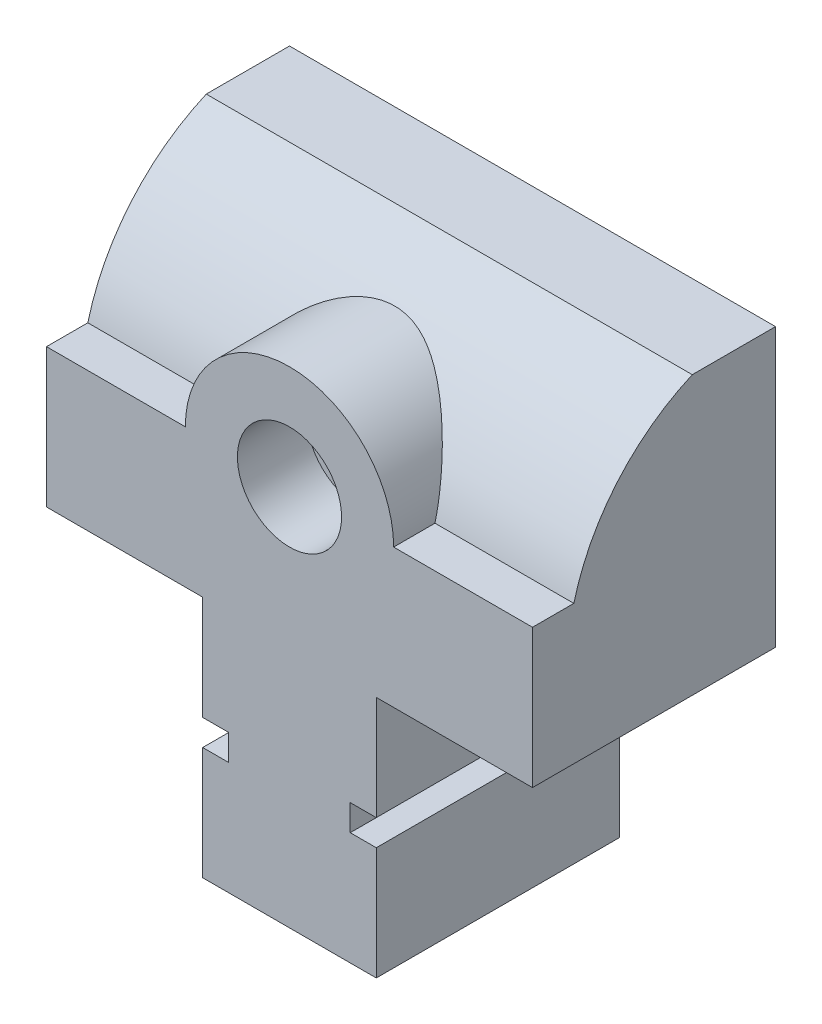
ISO-10303-21;
HEADER;
FILE_DESCRIPTION(('STEP AP214'),'2;1');
FILE_NAME('part.step','',(''),(''),'','','');
FILE_SCHEMA(('AUTOMOTIVE_DESIGN { 1 0 10303 214 1 1 1 1 }'));
ENDSEC;
DATA;
#1=APPLICATION_CONTEXT('core data for automotive mechanical design processes');
#2=APPLICATION_PROTOCOL_DEFINITION('international standard','automotive_design',2000,#1);
#3=PRODUCT_CONTEXT('',#1,'mechanical');
#4=PRODUCT('Part','Part','',(#3));
#5=PRODUCT_RELATED_PRODUCT_CATEGORY('part','',(#4));
#6=PRODUCT_DEFINITION_FORMATION('','',#4);
#7=PRODUCT_DEFINITION_CONTEXT('part definition',#1,'design');
#8=PRODUCT_DEFINITION('design','',#6,#7);
#9=PRODUCT_DEFINITION_SHAPE('','',#8);
#10=(LENGTH_UNIT() NAMED_UNIT(*) SI_UNIT(.MILLI.,.METRE.));
#11=(NAMED_UNIT(*) PLANE_ANGLE_UNIT() SI_UNIT($,.RADIAN.));
#12=(NAMED_UNIT(*) SI_UNIT($,.STERADIAN.) SOLID_ANGLE_UNIT());
#13=UNCERTAINTY_MEASURE_WITH_UNIT(LENGTH_MEASURE(1.E-05),#10,'distance_accuracy_value','');
#14=(GEOMETRIC_REPRESENTATION_CONTEXT(3) GLOBAL_UNCERTAINTY_ASSIGNED_CONTEXT((#13)) GLOBAL_UNIT_ASSIGNED_CONTEXT((#10,
#11,#12)) REPRESENTATION_CONTEXT('',''));
#15=CARTESIAN_POINT('',(0.,0.,0.));
#16=DIRECTION('',(0.,0.,1.));
#17=DIRECTION('',(1.,0.,0.));
#18=AXIS2_PLACEMENT_3D('',#15,#16,#17);
#19=CARTESIAN_POINT('',(0.,0.,-44.45));
#20=DIRECTION('',(-1.,0.,0.));
#21=DIRECTION('',(0.,0.,1.));
#22=AXIS2_PLACEMENT_3D('',#19,#20,#21);
#23=PLANE('',#22);
#24=DIRECTION('',(0.,-1.,0.));
#25=VECTOR('',#24,1.);
#26=CARTESIAN_POINT('',(0.,0.,0.));
#27=LINE('',#26,#25);
#28=CARTESIAN_POINT('',(0.,20.6375,0.));
#29=VERTEX_POINT('',#28);
#30=CARTESIAN_POINT('',(0.,0.,0.));
#31=VERTEX_POINT('',#30);
#32=EDGE_CURVE('E269',#29,#31,#27,.T.);
#33=ORIENTED_EDGE('',*,*,#32,.F.);
#34=DIRECTION('',(0.,0.,1.));
#35=VECTOR('',#34,1.);
#36=CARTESIAN_POINT('',(0.,20.6375,-44.45));
#37=LINE('',#36,#35);
#38=CARTESIAN_POINT('',(0.,20.6375,-44.45));
#39=VERTEX_POINT('',#38);
#40=EDGE_CURVE('E206',#39,#29,#37,.T.);
#41=ORIENTED_EDGE('',*,*,#40,.F.);
#42=DIRECTION('',(0.,-1.,0.));
#43=VECTOR('',#42,1.);
#44=CARTESIAN_POINT('',(0.,0.,-44.45));
#45=LINE('',#44,#43);
#46=CARTESIAN_POINT('',(0.,0.,-44.45));
#47=VERTEX_POINT('',#46);
#48=EDGE_CURVE('E195',#39,#47,#45,.T.);
#49=ORIENTED_EDGE('',*,*,#48,.T.);
#50=DIRECTION('',(0.,0.,1.));
#51=VECTOR('',#50,1.);
#52=CARTESIAN_POINT('',(0.,0.,-44.45));
#53=LINE('',#52,#51);
#54=EDGE_CURVE('E42',#47,#31,#53,.T.);
#55=ORIENTED_EDGE('',*,*,#54,.T.);
#56=EDGE_LOOP('',(#33,#41,#49,#55));
#57=FACE_BOUND('',#56,.T.);
#58=ADVANCED_FACE('F39',(#57),#23,.T.);
#59=CARTESIAN_POINT('',(0.,44.45,-44.45));
#60=VERTEX_POINT('',#59);
#61=CARTESIAN_POINT('',(0.,25.4,-44.45));
#62=VERTEX_POINT('',#61);
#63=EDGE_CURVE('E270',#60,#62,#45,.T.);
#64=ORIENTED_EDGE('',*,*,#63,.T.);
#65=DIRECTION('',(0.,0.,1.));
#66=VECTOR('',#65,1.);
#67=CARTESIAN_POINT('',(0.,25.4,-44.45));
#68=LINE('',#67,#66);
#69=CARTESIAN_POINT('',(0.,25.4,0.));
#70=VERTEX_POINT('',#69);
#71=EDGE_CURVE('E209',#62,#70,#68,.T.);
#72=ORIENTED_EDGE('',*,*,#71,.T.);
#73=CARTESIAN_POINT('',(0.,44.45,0.));
#74=VERTEX_POINT('',#73);
#75=EDGE_CURVE('E320',#74,#70,#27,.T.);
#76=ORIENTED_EDGE('',*,*,#75,.F.);
#77=DIRECTION('',(0.,0.,1.));
#78=VECTOR('',#77,1.);
#79=CARTESIAN_POINT('',(0.,44.45,-44.45));
#80=LINE('',#79,#78);
#81=EDGE_CURVE('E11',#60,#74,#80,.T.);
#82=ORIENTED_EDGE('',*,*,#81,.F.);
#83=EDGE_LOOP('',(#64,#72,#76,#82));
#84=FACE_BOUND('',#83,.T.);
#85=ADVANCED_FACE('F308',(#84),#23,.T.);
#86=CARTESIAN_POINT('',(31.75,0.,-44.45));
#87=DIRECTION('',(1.,0.,0.));
#88=DIRECTION('',(0.,0.,-1.));
#89=AXIS2_PLACEMENT_3D('',#86,#87,#88);
#90=PLANE('',#89);
#91=DIRECTION('',(0.,0.,1.));
#92=VECTOR('',#91,1.);
#93=CARTESIAN_POINT('',(31.75,25.4,-44.45));
#94=LINE('',#93,#92);
#95=CARTESIAN_POINT('',(31.75,25.4,-44.45));
#96=VERTEX_POINT('',#95);
#97=CARTESIAN_POINT('',(31.75,25.4,0.));
#98=VERTEX_POINT('',#97);
#99=EDGE_CURVE('E230',#96,#98,#94,.T.);
#100=ORIENTED_EDGE('',*,*,#99,.F.);
#101=DIRECTION('',(0.,1.,0.));
#102=VECTOR('',#101,1.);
#103=CARTESIAN_POINT('',(31.75,0.,-44.45));
#104=LINE('',#103,#102);
#105=CARTESIAN_POINT('',(31.75,44.45,-44.45));
#106=VERTEX_POINT('',#105);
#107=EDGE_CURVE('E384',#96,#106,#104,.T.);
#108=ORIENTED_EDGE('',*,*,#107,.T.);
#109=DIRECTION('',(0.,0.,1.));
#110=VECTOR('',#109,1.);
#111=CARTESIAN_POINT('',(31.75,44.45,-44.45));
#112=LINE('',#111,#110);
#113=CARTESIAN_POINT('',(31.75,44.45,0.));
#114=VERTEX_POINT('',#113);
#115=EDGE_CURVE('E365',#106,#114,#112,.T.);
#116=ORIENTED_EDGE('',*,*,#115,.T.);
#117=DIRECTION('',(0.,1.,0.));
#118=VECTOR('',#117,1.);
#119=CARTESIAN_POINT('',(31.75,0.,0.));
#120=LINE('',#119,#118);
#121=EDGE_CURVE('E329',#98,#114,#120,.T.);
#122=ORIENTED_EDGE('',*,*,#121,.F.);
#123=EDGE_LOOP('',(#100,#108,#116,#122));
#124=FACE_BOUND('',#123,.T.);
#125=ADVANCED_FACE('F288',(#124),#90,.T.);
#126=CARTESIAN_POINT('',(15.875,69.85,-44.45));
#127=DIRECTION('',(0.,0.,-1.));
#128=DIRECTION('',(-1.,0.,0.));
#129=AXIS2_PLACEMENT_3D('',#126,#127,#128);
#130=PLANE('',#129);
#131=ORIENTED_EDGE('',*,*,#48,.F.);
#132=DIRECTION('',(-1.,0.,0.));
#133=VECTOR('',#132,1.);
#134=CARTESIAN_POINT('',(0.,20.6375,-44.45));
#135=LINE('',#134,#133);
#136=CARTESIAN_POINT('',(4.7625,20.6375,-44.45));
#137=VERTEX_POINT('',#136);
#138=EDGE_CURVE('E187',#137,#39,#135,.T.);
#139=ORIENTED_EDGE('',*,*,#138,.F.);
#140=DIRECTION('',(0.,-1.,0.));
#141=VECTOR('',#140,1.);
#142=CARTESIAN_POINT('',(4.76250000000001,0.,-44.45));
#143=LINE('',#142,#141);
#144=CARTESIAN_POINT('',(4.7625,25.4,-44.45));
#145=VERTEX_POINT('',#144);
#146=EDGE_CURVE('E177',#145,#137,#143,.T.);
#147=ORIENTED_EDGE('',*,*,#146,.F.);
#148=DIRECTION('',(1.,0.,0.));
#149=VECTOR('',#148,1.);
#150=CARTESIAN_POINT('',(0.,25.4,-44.45));
#151=LINE('',#150,#149);
#152=EDGE_CURVE('E186',#62,#145,#151,.T.);
#153=ORIENTED_EDGE('',*,*,#152,.F.);
#154=ORIENTED_EDGE('',*,*,#63,.F.);
#155=DIRECTION('',(1.,0.,0.));
#156=VECTOR('',#155,1.);
#157=CARTESIAN_POINT('',(0.,44.45,-44.45));
#158=LINE('',#157,#156);
#159=CARTESIAN_POINT('',(-28.575,44.45,-44.45));
#160=VERTEX_POINT('',#159);
#161=EDGE_CURVE('E326',#160,#60,#158,.T.);
#162=ORIENTED_EDGE('',*,*,#161,.F.);
#163=DIRECTION('',(0.,-1.,0.));
#164=VECTOR('',#163,1.);
#165=CARTESIAN_POINT('',(-28.575,44.45,-44.45));
#166=LINE('',#165,#164);
#167=CARTESIAN_POINT('',(-28.575,95.25,-44.45));
#168=VERTEX_POINT('',#167);
#169=EDGE_CURVE('E372',#168,#160,#166,.T.);
#170=ORIENTED_EDGE('',*,*,#169,.F.);
#171=DIRECTION('',(-1.,0.,0.));
#172=VECTOR('',#171,1.);
#173=CARTESIAN_POINT('',(60.325,95.25,-44.45));
#174=LINE('',#173,#172);
#175=CARTESIAN_POINT('',(60.325,95.25,-44.45));
#176=VERTEX_POINT('',#175);
#177=EDGE_CURVE('E253',#176,#168,#174,.T.);
#178=ORIENTED_EDGE('',*,*,#177,.F.);
#179=DIRECTION('',(0.,1.,0.));
#180=VECTOR('',#179,1.);
#181=CARTESIAN_POINT('',(60.325,44.45,-44.45));
#182=LINE('',#181,#180);
#183=CARTESIAN_POINT('',(60.325,44.45,-44.45));
#184=VERTEX_POINT('',#183);
#185=EDGE_CURVE('E375',#184,#176,#182,.T.);
#186=ORIENTED_EDGE('',*,*,#185,.F.);
#187=DIRECTION('',(1.,0.,0.));
#188=VECTOR('',#187,1.);
#189=CARTESIAN_POINT('',(31.75,44.45,-44.45));
#190=LINE('',#189,#188);
#191=EDGE_CURVE('E377',#106,#184,#190,.T.);
#192=ORIENTED_EDGE('',*,*,#191,.F.);
#193=ORIENTED_EDGE('',*,*,#107,.F.);
#194=DIRECTION('',(-1.,0.,0.));
#195=VECTOR('',#194,1.);
#196=CARTESIAN_POINT('',(0.,25.4,-44.45));
#197=LINE('',#196,#195);
#198=CARTESIAN_POINT('',(26.9875,25.4,-44.45));
#199=VERTEX_POINT('',#198);
#200=EDGE_CURVE('E220',#96,#199,#197,.T.);
#201=ORIENTED_EDGE('',*,*,#200,.T.);
#202=DIRECTION('',(0.,-1.,0.));
#203=VECTOR('',#202,1.);
#204=CARTESIAN_POINT('',(26.9875,0.,-44.45));
#205=LINE('',#204,#203);
#206=CARTESIAN_POINT('',(26.9875,20.6375,-44.45));
#207=VERTEX_POINT('',#206);
#208=EDGE_CURVE('E213',#199,#207,#205,.T.);
#209=ORIENTED_EDGE('',*,*,#208,.T.);
#210=DIRECTION('',(1.,0.,0.));
#211=VECTOR('',#210,1.);
#212=CARTESIAN_POINT('',(0.,20.6375,-44.45));
#213=LINE('',#212,#211);
#214=CARTESIAN_POINT('',(31.75,20.6375,-44.45));
#215=VERTEX_POINT('',#214);
#216=EDGE_CURVE('E216',#207,#215,#213,.T.);
#217=ORIENTED_EDGE('',*,*,#216,.T.);
#218=CARTESIAN_POINT('',(31.75,0.,-44.45));
#219=VERTEX_POINT('',#218);
#220=EDGE_CURVE('E382',#219,#215,#104,.T.);
#221=ORIENTED_EDGE('',*,*,#220,.F.);
#222=DIRECTION('',(1.,0.,0.));
#223=VECTOR('',#222,1.);
#224=CARTESIAN_POINT('',(0.,0.,-44.45));
#225=LINE('',#224,#223);
#226=EDGE_CURVE('E385',#47,#219,#225,.T.);
#227=ORIENTED_EDGE('',*,*,#226,.F.);
#228=EDGE_LOOP('',(#131,#139,#147,#153,#154,#162,#170,#178,#186,#192,#193,#201,#209,#217,#221,#227));
#229=FACE_BOUND('',#228,.T.);
#230=ADVANCED_FACE('F193',(#229),#130,.T.);
#231=CARTESIAN_POINT('',(15.875,69.85,0.));
#232=DIRECTION('',(0.,0.,-1.));
#233=DIRECTION('',(-1.,0.,0.));
#234=AXIS2_PLACEMENT_3D('',#231,#232,#233);
#235=PLANE('',#234);
#236=CARTESIAN_POINT('',(15.875,69.85,0.));
#237=DIRECTION('',(0.,0.,1.));
#238=DIRECTION('',(1.,0.,0.));
#239=AXIS2_PLACEMENT_3D('',#236,#237,#238);
#240=CIRCLE('',#239,9.525);
#241=CARTESIAN_POINT('',(25.4,69.85,0.));
#242=VERTEX_POINT('',#241);
#243=EDGE_CURVE('E208',#242,#242,#240,.T.);
#244=ORIENTED_EDGE('',*,*,#243,.F.);
#245=EDGE_LOOP('',(#244));
#246=FACE_BOUND('',#245,.T.);
#247=DIRECTION('',(-1.,0.,0.));
#248=VECTOR('',#247,1.);
#249=CARTESIAN_POINT('',(0.,20.6375,0.));
#250=LINE('',#249,#248);
#251=CARTESIAN_POINT('',(4.76250000000001,20.6375,0.));
#252=VERTEX_POINT('',#251);
#253=EDGE_CURVE('E55',#252,#29,#250,.T.);
#254=ORIENTED_EDGE('',*,*,#253,.T.);
#255=ORIENTED_EDGE('',*,*,#32,.T.);
#256=DIRECTION('',(1.,0.,0.));
#257=VECTOR('',#256,1.);
#258=CARTESIAN_POINT('',(0.,0.,0.));
#259=LINE('',#258,#257);
#260=CARTESIAN_POINT('',(31.75,0.,0.));
#261=VERTEX_POINT('',#260);
#262=EDGE_CURVE('E323',#31,#261,#259,.T.);
#263=ORIENTED_EDGE('',*,*,#262,.T.);
#264=CARTESIAN_POINT('',(31.75,20.6375,0.));
#265=VERTEX_POINT('',#264);
#266=EDGE_CURVE('E330',#261,#265,#120,.T.);
#267=ORIENTED_EDGE('',*,*,#266,.T.);
#268=DIRECTION('',(1.,0.,0.));
#269=VECTOR('',#268,1.);
#270=CARTESIAN_POINT('',(0.,20.6375,0.));
#271=LINE('',#270,#269);
#272=CARTESIAN_POINT('',(26.9875,20.6375,0.));
#273=VERTEX_POINT('',#272);
#274=EDGE_CURVE('E225',#273,#265,#271,.T.);
#275=ORIENTED_EDGE('',*,*,#274,.F.);
#276=DIRECTION('',(0.,-1.,0.));
#277=VECTOR('',#276,1.);
#278=CARTESIAN_POINT('',(26.9875,0.,0.));
#279=LINE('',#278,#277);
#280=CARTESIAN_POINT('',(26.9875,25.4,0.));
#281=VERTEX_POINT('',#280);
#282=EDGE_CURVE('E63',#281,#273,#279,.T.);
#283=ORIENTED_EDGE('',*,*,#282,.F.);
#284=DIRECTION('',(-1.,0.,0.));
#285=VECTOR('',#284,1.);
#286=CARTESIAN_POINT('',(0.,25.4,0.));
#287=LINE('',#286,#285);
#288=EDGE_CURVE('E217',#98,#281,#287,.T.);
#289=ORIENTED_EDGE('',*,*,#288,.F.);
#290=ORIENTED_EDGE('',*,*,#121,.T.);
#291=DIRECTION('',(1.,0.,0.));
#292=VECTOR('',#291,1.);
#293=CARTESIAN_POINT('',(31.75,44.45,0.));
#294=LINE('',#293,#292);
#295=CARTESIAN_POINT('',(60.325,44.45,0.));
#296=VERTEX_POINT('',#295);
#297=EDGE_CURVE('E333',#114,#296,#294,.T.);
#298=ORIENTED_EDGE('',*,*,#297,.T.);
#299=DIRECTION('',(0.,1.,0.));
#300=VECTOR('',#299,1.);
#301=CARTESIAN_POINT('',(60.325,44.45,0.));
#302=LINE('',#301,#300);
#303=CARTESIAN_POINT('',(60.325,69.85,0.));
#304=VERTEX_POINT('',#303);
#305=EDGE_CURVE('E336',#296,#304,#302,.T.);
#306=ORIENTED_EDGE('',*,*,#305,.T.);
#307=DIRECTION('',(-1.,0.,0.));
#308=VECTOR('',#307,1.);
#309=CARTESIAN_POINT('',(60.325,69.85,0.));
#310=LINE('',#309,#308);
#311=CARTESIAN_POINT('',(34.925,69.85,0.));
#312=VERTEX_POINT('',#311);
#313=EDGE_CURVE('E339',#304,#312,#310,.T.);
#314=ORIENTED_EDGE('',*,*,#313,.T.);
#315=CARTESIAN_POINT('',(15.875,69.85,0.));
#316=DIRECTION('',(0.,0.,1.));
#317=DIRECTION('',(-1.,0.,0.));
#318=AXIS2_PLACEMENT_3D('',#315,#316,#317);
#319=CIRCLE('',#318,19.05);
#320=CARTESIAN_POINT('',(-3.175,69.85,0.));
#321=VERTEX_POINT('',#320);
#322=EDGE_CURVE('E342',#312,#321,#319,.T.);
#323=ORIENTED_EDGE('',*,*,#322,.T.);
#324=DIRECTION('',(-1.,0.,0.));
#325=VECTOR('',#324,1.);
#326=CARTESIAN_POINT('',(-28.575,69.85,0.));
#327=LINE('',#326,#325);
#328=CARTESIAN_POINT('',(-28.575,69.85,0.));
#329=VERTEX_POINT('',#328);
#330=EDGE_CURVE('E345',#321,#329,#327,.T.);
#331=ORIENTED_EDGE('',*,*,#330,.T.);
#332=DIRECTION('',(0.,-1.,0.));
#333=VECTOR('',#332,1.);
#334=CARTESIAN_POINT('',(-28.575,44.45,0.));
#335=LINE('',#334,#333);
#336=CARTESIAN_POINT('',(-28.575,44.45,0.));
#337=VERTEX_POINT('',#336);
#338=EDGE_CURVE('E348',#329,#337,#335,.T.);
#339=ORIENTED_EDGE('',*,*,#338,.T.);
#340=DIRECTION('',(1.,0.,0.));
#341=VECTOR('',#340,1.);
#342=CARTESIAN_POINT('',(0.,44.45,0.));
#343=LINE('',#342,#341);
#344=EDGE_CURVE('E351',#337,#74,#343,.T.);
#345=ORIENTED_EDGE('',*,*,#344,.T.);
#346=ORIENTED_EDGE('',*,*,#75,.T.);
#347=DIRECTION('',(1.,0.,0.));
#348=VECTOR('',#347,1.);
#349=CARTESIAN_POINT('',(0.,25.4,0.));
#350=LINE('',#349,#348);
#351=CARTESIAN_POINT('',(4.7625,25.4,0.));
#352=VERTEX_POINT('',#351);
#353=EDGE_CURVE('E196',#70,#352,#350,.T.);
#354=ORIENTED_EDGE('',*,*,#353,.T.);
#355=DIRECTION('',(0.,-1.,0.));
#356=VECTOR('',#355,1.);
#357=CARTESIAN_POINT('',(4.76250000000001,0.,0.));
#358=LINE('',#357,#356);
#359=EDGE_CURVE('E199',#352,#252,#358,.T.);
#360=ORIENTED_EDGE('',*,*,#359,.T.);
#361=EDGE_LOOP('',(#254,#255,#263,#267,#275,#283,#289,#290,#298,#306,#314,#323,#331,#339,#345,
#346,#354,#360));
#362=FACE_BOUND('',#361,.T.);
#363=ADVANCED_FACE('F287',(#246,#362),#235,.F.);
#364=CARTESIAN_POINT('',(0.,44.45,-44.45));
#365=DIRECTION('',(0.,-1.,0.));
#366=DIRECTION('',(1.,0.,0.));
#367=AXIS2_PLACEMENT_3D('',#364,#365,#366);
#368=PLANE('',#367);
#369=ORIENTED_EDGE('',*,*,#344,.F.);
#370=DIRECTION('',(0.,0.,1.));
#371=VECTOR('',#370,1.);
#372=CARTESIAN_POINT('',(-28.575,44.45,-44.45));
#373=LINE('',#372,#371);
#374=EDGE_CURVE('E47',#160,#337,#373,.T.);
#375=ORIENTED_EDGE('',*,*,#374,.F.);
#376=ORIENTED_EDGE('',*,*,#161,.T.);
#377=ORIENTED_EDGE('',*,*,#81,.T.);
#378=EDGE_LOOP('',(#369,#375,#376,#377));
#379=FACE_BOUND('',#378,.T.);
#380=ADVANCED_FACE('F291',(#379),#368,.T.);
#381=CARTESIAN_POINT('',(-28.575,44.45,-44.45));
#382=DIRECTION('',(-1.,0.,0.));
#383=DIRECTION('',(0.,0.,1.));
#384=AXIS2_PLACEMENT_3D('',#381,#382,#383);
#385=PLANE('',#384);
#386=ORIENTED_EDGE('',*,*,#338,.F.);
#387=DIRECTION('',(0.,0.,1.));
#388=VECTOR('',#387,1.);
#389=CARTESIAN_POINT('',(-28.575,69.85,-44.45));
#390=LINE('',#389,#388);
#391=CARTESIAN_POINT('',(-28.575,69.85,-7.55983362737435));
#392=VERTEX_POINT('',#391);
#393=EDGE_CURVE('E355',#392,#329,#390,.T.);
#394=ORIENTED_EDGE('',*,*,#393,.F.);
#395=CARTESIAN_POINT('',(-28.575,60.325,-44.45));
#396=DIRECTION('',(-1.,0.,0.));
#397=DIRECTION('',(0.,0.,1.));
#398=AXIS2_PLACEMENT_3D('',#395,#396,#397);
#399=CIRCLE('',#398,38.1);
#400=CARTESIAN_POINT('',(-28.575,95.25,-29.2232349134821));
#401=VERTEX_POINT('',#400);
#402=EDGE_CURVE('E239',#392,#401,#399,.T.);
#403=ORIENTED_EDGE('',*,*,#402,.T.);
#404=DIRECTION('',(0.,0.,1.));
#405=VECTOR('',#404,1.);
#406=CARTESIAN_POINT('',(-28.575,95.25,0.));
#407=LINE('',#406,#405);
#408=EDGE_CURVE('E246',#168,#401,#407,.T.);
#409=ORIENTED_EDGE('',*,*,#408,.F.);
#410=ORIENTED_EDGE('',*,*,#169,.T.);
#411=ORIENTED_EDGE('',*,*,#374,.T.);
#412=EDGE_LOOP('',(#386,#394,#403,#409,#410,#411));
#413=FACE_BOUND('',#412,.T.);
#414=ADVANCED_FACE('F295',(#413),#385,.T.);
#415=CARTESIAN_POINT('',(-28.575,69.85,-44.45));
#416=DIRECTION('',(0.,1.,0.));
#417=DIRECTION('',(-1.,0.,0.));
#418=AXIS2_PLACEMENT_3D('',#415,#416,#417);
#419=PLANE('',#418);
#420=DIRECTION('',(-1.,0.,0.));
#421=VECTOR('',#420,1.);
#422=CARTESIAN_POINT('',(60.325,69.85,-7.55983362737435));
#423=LINE('',#422,#421);
#424=CARTESIAN_POINT('',(-3.175,69.85,-7.55983362737436));
#425=VERTEX_POINT('',#424);
#426=EDGE_CURVE('E248',#425,#392,#423,.T.);
#427=ORIENTED_EDGE('',*,*,#426,.T.);
#428=ORIENTED_EDGE('',*,*,#393,.T.);
#429=ORIENTED_EDGE('',*,*,#330,.F.);
#430=DIRECTION('',(0.,0.,1.));
#431=VECTOR('',#430,1.);
#432=CARTESIAN_POINT('',(-3.175,69.85,-44.45));
#433=LINE('',#432,#431);
#434=EDGE_CURVE('E357',#425,#321,#433,.T.);
#435=ORIENTED_EDGE('',*,*,#434,.F.);
#436=EDGE_LOOP('',(#427,#428,#429,#435));
#437=FACE_BOUND('',#436,.T.);
#438=ADVANCED_FACE('F298',(#437),#419,.T.);
#439=CARTESIAN_POINT('',(15.875,69.85,-44.45));
#440=DIRECTION('',(0.,0.,1.));
#441=DIRECTION('',(1.,0.,0.));
#442=AXIS2_PLACEMENT_3D('',#439,#440,#441);
#443=CYLINDRICAL_SURFACE('',#442,19.05);
#444=CARTESIAN_POINT('',(-3.175,69.85,-7.55983362737436));
#445=CARTESIAN_POINT('',(-3.17500547879675,70.1230381179598,-7.63032401139053));
#446=CARTESIAN_POINT('',(-3.1691301429011,70.3952771590789,-7.70385672116213));
#447=CARTESIAN_POINT('',(-3.14586417103013,70.9375755266592,-7.85679773490777));
#448=CARTESIAN_POINT('',(-3.1284747268772,71.2076350757909,-7.93620543000801));
#449=CARTESIAN_POINT('',(-3.08244757334969,71.7448068209935,-8.10062770595717));
#450=CARTESIAN_POINT('',(-3.05382004286125,72.0119214599555,-8.18563715520324));
#451=CARTESIAN_POINT('',(-2.98560139008859,72.5429346413271,-8.3610778137843));
#452=CARTESIAN_POINT('',(-2.94601001349025,72.806833108987,-8.45150914884563));
#453=CARTESIAN_POINT('',(-2.81183898791234,73.589424425054,-8.72928070732571));
#454=CARTESIAN_POINT('',(-2.701528933279,74.1028128054364,-8.92426509622703));
#455=CARTESIAN_POINT('',(-2.44126051409261,75.1120222906019,-9.33233325824833));
#456=CARTESIAN_POINT('',(-2.29129363081517,75.6078395949425,-9.54542091346656));
#457=CARTESIAN_POINT('',(-1.95484576685341,76.5776700960323,-9.98634692918719));
#458=CARTESIAN_POINT('',(-1.76850240510362,77.0517574036756,-10.2141275936446));
#459=CARTESIAN_POINT('',(-1.36132651251976,77.9781980650538,-10.6824999755396));
#460=CARTESIAN_POINT('',(-1.14049579154312,78.4305525576741,-10.9230910202666));
#461=CARTESIAN_POINT('',(-0.66594241299499,79.313157047446,-11.4149325293189));
#462=CARTESIAN_POINT('',(-0.412147971948656,79.7433558552655,-11.6662054272559));
#463=CARTESIAN_POINT('',(0.126116933928054,80.5795128912606,-12.1761010582385));
#464=CARTESIAN_POINT('',(0.410589310832286,80.9854696060383,-12.4347242486674));
#465=CARTESIAN_POINT('',(1.04916727588222,81.8254720988806,-12.9916667031903));
#466=CARTESIAN_POINT('',(1.40748748067741,82.2558960109427,-13.2906258598657));
#467=CARTESIAN_POINT('',(2.16017557946289,83.083251491138,-13.889684449069));
#468=CARTESIAN_POINT('',(2.55454945550945,83.4801774801792,-14.1897840628768));
#469=CARTESIAN_POINT('',(3.37823711735071,84.2391282010068,-14.7859265153288));
#470=CARTESIAN_POINT('',(3.8075444779333,84.6011593242634,-15.0819700883379));
#471=CARTESIAN_POINT('',(4.70064942714583,85.2887139694636,-15.6641402898413));
#472=CARTESIAN_POINT('',(5.16443783720706,85.6142471493997,-15.9502695279287));
#473=CARTESIAN_POINT('',(6.01641161260063,86.1565661796919,-16.4421088935393));
#474=CARTESIAN_POINT('',(6.39763844913468,86.3811985743116,-16.6512485452456));
#475=CARTESIAN_POINT('',(7.18058837282127,86.8060625792829,-17.0556704527247));
#476=CARTESIAN_POINT('',(7.58231105269622,87.0062946742309,-17.2509529836713));
#477=CARTESIAN_POINT('',(8.4052917481255,87.3802565399939,-17.6229138610059));
#478=CARTESIAN_POINT('',(8.82651496700411,87.5540313116237,-17.7996236352474));
#479=CARTESIAN_POINT('',(9.68853407888225,87.8733541682059,-18.1298370055459));
#480=CARTESIAN_POINT('',(10.1293315905514,88.0188999134353,-18.2833386777998));
#481=CARTESIAN_POINT('',(10.9289435134693,88.250319287126,-18.5307301587318));
#482=CARTESIAN_POINT('',(11.2842507723209,88.3422677802285,-18.6302898887847));
#483=CARTESIAN_POINT('',(12.0042271171504,88.5062536396269,-18.8093740237486));
#484=CARTESIAN_POINT('',(12.3688906903766,88.5783024492052,-18.8889099409842));
#485=CARTESIAN_POINT('',(13.1055926571716,88.7013182367587,-19.0255424900239));
#486=CARTESIAN_POINT('',(13.4776240954078,88.7523041890183,-19.0826593155405));
#487=CARTESIAN_POINT('',(14.2269849828965,88.8323208228693,-19.1726126783494));
#488=CARTESIAN_POINT('',(14.6043144313298,88.8613515078548,-19.2054492193953));
#489=CARTESIAN_POINT('',(15.3630201353336,88.8969210018964,-19.245713221049));
#490=CARTESIAN_POINT('',(15.7444067887727,88.9033633016003,-19.2530316542676));
#491=CARTESIAN_POINT('',(16.5064778359285,88.8933440967106,-19.2416726551929));
#492=CARTESIAN_POINT('',(16.8871622420703,88.8768830013265,-19.2229956873534));
#493=CARTESIAN_POINT('',(17.6450339219224,88.8213983360249,-19.1603377913137));
#494=CARTESIAN_POINT('',(18.0222185332725,88.7823588248852,-19.1163389850384));
#495=CARTESIAN_POINT('',(18.7701221929395,88.682503150465,-19.0046155459859));
#496=CARTESIAN_POINT('',(19.140840456563,88.6216843632794,-18.9368880544658));
#497=CARTESIAN_POINT('',(19.940450407011,88.4663724712672,-18.7655913657086));
#498=CARTESIAN_POINT('',(20.3676250495655,88.3677614672179,-18.6577387619262));
#499=CARTESIAN_POINT('',(21.2073168787841,88.1436568178792,-18.4161872291882));
#500=CARTESIAN_POINT('',(21.6198311525133,88.0181578645351,-18.2824831973107));
#501=CARTESIAN_POINT('',(22.4293657658431,87.7420661478692,-17.9933473624511));
#502=CARTESIAN_POINT('',(22.8263567520035,87.5914284368499,-17.8378767227826));
#503=CARTESIAN_POINT('',(23.6032614574483,87.2670528903227,-17.5095271476803));
#504=CARTESIAN_POINT('',(23.9831738321902,87.0933132403224,-17.3366468451007));
#505=CARTESIAN_POINT('',(24.8703228784114,86.6523403584388,-16.9071410375273));
#506=CARTESIAN_POINT('',(25.3694935937383,86.3750549652233,-16.644131186376));
#507=CARTESIAN_POINT('',(26.334137599528,85.7820336647363,-16.1001939352458));
#508=CARTESIAN_POINT('',(26.7995981359794,85.4662833244482,-15.8192598285825));
#509=CARTESIAN_POINT('',(27.6970410072612,84.7984088517969,-15.2463012927259));
#510=CARTESIAN_POINT('',(28.1289947874556,84.4462542789019,-14.9542677134991));
#511=CARTESIAN_POINT('',(28.9585782492833,83.7075221421877,-14.3652721862612));
#512=CARTESIAN_POINT('',(29.3562120045833,83.3209486748672,-14.0683108281626));
#513=CARTESIAN_POINT('',(30.1250146215462,82.5054599361923,-13.4677564876025));
#514=CARTESIAN_POINT('',(30.49537763277,82.0757825915973,-13.1641660193681));
#515=CARTESIAN_POINT('',(31.197879630298,81.182896159049,-12.5619430514163));
#516=CARTESIAN_POINT('',(31.5300154875129,80.7196843311742,-12.2633109592772));
#517=CARTESIAN_POINT('',(32.1536503711684,79.7613403057755,-11.6757047773472));
#518=CARTESIAN_POINT('',(32.4451729768145,79.2662268759311,-11.3867251582524));
#519=CARTESIAN_POINT('',(32.9849562889441,78.2455358864135,-10.8225674971643));
#520=CARTESIAN_POINT('',(33.2332260873938,77.7199647601368,-10.5473865632976));
#521=CARTESIAN_POINT('',(33.650648615447,76.718691932598,-10.0534610112358));
#522=CARTESIAN_POINT('',(33.8260511413674,76.2467764986723,-9.83231134879015));
#523=CARTESIAN_POINT('',(34.140538613139,75.284057222716,-9.4055460725108));
#524=CARTESIAN_POINT('',(34.2796205585369,74.7932518240204,-9.19993174305183));
#525=CARTESIAN_POINT('',(34.5187592617292,73.7964924995568,-8.80711593682397));
#526=CARTESIAN_POINT('',(34.618911579589,73.2905789925122,-8.61987022730984));
#527=CARTESIAN_POINT('',(34.7783222075838,72.2656816333617,-8.26542167729335));
#528=CARTESIAN_POINT('',(34.8376069147362,71.74670644299,-8.09820595690011));
#529=CARTESIAN_POINT('',(34.8918827773565,70.9957299675846,-7.87402495156471));
#530=CARTESIAN_POINT('',(34.90427242925,70.7674985274412,-7.80821076794026));
#531=CARTESIAN_POINT('',(34.920828401276,70.3097076342974,-7.68082786757024));
#532=CARTESIAN_POINT('',(34.92499970808,70.0801490714287,-7.61925659824087));
#533=CARTESIAN_POINT('',(34.925,69.85,-7.55983362737435));
#534=B_SPLINE_CURVE_WITH_KNOTS('',3,(#444,#445,#446,#447,#448,#449,#450,#451,#452,#453,#454,
#455,#456,#457,#458,#459,#460,#461,#462,#463,#464,#465,#466,#467,#468,#469,#470,#471,#472,#473,
#474,#475,#476,#477,#478,#479,#480,#481,#482,#483,#484,#485,#486,#487,#488,#489,#490,#491,#492,
#493,#494,#495,#496,#497,#498,#499,#500,#501,#502,#503,#504,#505,#506,#507,#508,#509,#510,#511,
#512,#513,#514,#515,#516,#517,#518,#519,#520,#521,#522,#523,#524,#525,#526,#527,#528,#529,#530,
#531,#532,#533),.UNSPECIFIED.,.F.,.F.,(4,2,2,2,2,2,2,2,2,2,2,2,2,2,2,2,2,2,2,2,2,2,2,2,2,2,2,2,
2,2,2,2,2,2,2,2,2,2,2,2,2,2,2,2,4),(0.,0.845872584427808,1.69165762648713,2.53667836054638,
3.38171869709822,5.05987555529411,6.7383931933501,8.4106796288294,10.0828783340885,
11.7587815505521,13.4347892820258,15.3373729097303,17.2402727906808,19.1428234645977,
21.0448694962263,22.5120416147588,23.9791845901255,25.4438035575953,26.9085438661089,
28.0483291407619,29.187457612518,30.3255576611495,31.4636575338407,32.6066140764586,
33.749550198398,34.8932942636274,36.0371761702606,37.3896155547435,38.7423221759745,
40.0974738500092,41.4527320244804,43.336041372373,45.2200595746686,47.1056660995974,
48.9910485009627,50.9192375805702,52.847584380287,54.7748069144166,56.701623846211,
58.3496696206831,59.9978514976371,61.6419616612941,63.2850088713867,63.9984181115596,
64.7113943406561),.UNSPECIFIED.);
#535=CARTESIAN_POINT('',(34.925,69.85,-7.55983362737435));
#536=VERTEX_POINT('',#535);
#537=EDGE_CURVE('E256',#425,#536,#534,.T.);
#538=ORIENTED_EDGE('',*,*,#537,.F.);
#539=ORIENTED_EDGE('',*,*,#434,.T.);
#540=ORIENTED_EDGE('',*,*,#322,.F.);
#541=DIRECTION('',(0.,0.,1.));
#542=VECTOR('',#541,1.);
#543=CARTESIAN_POINT('',(34.925,69.85,-44.45));
#544=LINE('',#543,#542);
#545=EDGE_CURVE('E359',#536,#312,#544,.T.);
#546=ORIENTED_EDGE('',*,*,#545,.F.);
#547=EDGE_LOOP('',(#538,#539,#540,#546));
#548=FACE_BOUND('',#547,.T.);
#549=ADVANCED_FACE('F272',(#548),#443,.T.);
#550=CARTESIAN_POINT('',(60.325,69.85,-44.45));
#551=DIRECTION('',(0.,1.,0.));
#552=DIRECTION('',(-1.,0.,0.));
#553=AXIS2_PLACEMENT_3D('',#550,#551,#552);
#554=PLANE('',#553);
#555=CARTESIAN_POINT('',(60.325,69.85,-7.55983362737435));
#556=VERTEX_POINT('',#555);
#557=EDGE_CURVE('E259',#556,#536,#423,.T.);
#558=ORIENTED_EDGE('',*,*,#557,.T.);
#559=ORIENTED_EDGE('',*,*,#545,.T.);
#560=ORIENTED_EDGE('',*,*,#313,.F.);
#561=DIRECTION('',(0.,0.,1.));
#562=VECTOR('',#561,1.);
#563=CARTESIAN_POINT('',(60.325,69.85,-44.45));
#564=LINE('',#563,#562);
#565=EDGE_CURVE('E361',#556,#304,#564,.T.);
#566=ORIENTED_EDGE('',*,*,#565,.F.);
#567=EDGE_LOOP('',(#558,#559,#560,#566));
#568=FACE_BOUND('',#567,.T.);
#569=ADVANCED_FACE('F305',(#568),#554,.T.);
#570=CARTESIAN_POINT('',(60.325,44.45,-44.45));
#571=DIRECTION('',(1.,0.,0.));
#572=DIRECTION('',(0.,0.,-1.));
#573=AXIS2_PLACEMENT_3D('',#570,#571,#572);
#574=PLANE('',#573);
#575=ORIENTED_EDGE('',*,*,#305,.F.);
#576=DIRECTION('',(0.,0.,1.));
#577=VECTOR('',#576,1.);
#578=CARTESIAN_POINT('',(60.325,44.45,-44.45));
#579=LINE('',#578,#577);
#580=EDGE_CURVE('E363',#184,#296,#579,.T.);
#581=ORIENTED_EDGE('',*,*,#580,.F.);
#582=ORIENTED_EDGE('',*,*,#185,.T.);
#583=DIRECTION('',(0.,0.,1.));
#584=VECTOR('',#583,1.);
#585=CARTESIAN_POINT('',(60.325,95.25,0.));
#586=LINE('',#585,#584);
#587=CARTESIAN_POINT('',(60.325,95.25,-29.2232349134821));
#588=VERTEX_POINT('',#587);
#589=EDGE_CURVE('E245',#176,#588,#586,.T.);
#590=ORIENTED_EDGE('',*,*,#589,.T.);
#591=CARTESIAN_POINT('',(60.325,60.325,-44.45));
#592=DIRECTION('',(-1.,0.,0.));
#593=DIRECTION('',(0.,0.,1.));
#594=AXIS2_PLACEMENT_3D('',#591,#592,#593);
#595=CIRCLE('',#594,38.1);
#596=EDGE_CURVE('E242',#556,#588,#595,.T.);
#597=ORIENTED_EDGE('',*,*,#596,.F.);
#598=ORIENTED_EDGE('',*,*,#565,.T.);
#599=EDGE_LOOP('',(#575,#581,#582,#590,#597,#598));
#600=FACE_BOUND('',#599,.T.);
#601=ADVANCED_FACE('F430',(#600),#574,.T.);
#602=CARTESIAN_POINT('',(31.75,44.45,-44.45));
#603=DIRECTION('',(0.,-1.,0.));
#604=DIRECTION('',(0.,0.,-1.));
#605=AXIS2_PLACEMENT_3D('',#602,#603,#604);
#606=PLANE('',#605);
#607=ORIENTED_EDGE('',*,*,#297,.F.);
#608=ORIENTED_EDGE('',*,*,#115,.F.);
#609=ORIENTED_EDGE('',*,*,#191,.T.);
#610=ORIENTED_EDGE('',*,*,#580,.T.);
#611=EDGE_LOOP('',(#607,#608,#609,#610));
#612=FACE_BOUND('',#611,.T.);
#613=ADVANCED_FACE('F417',(#612),#606,.T.);
#614=DIRECTION('',(0.,0.,1.));
#615=VECTOR('',#614,1.);
#616=CARTESIAN_POINT('',(31.75,20.6375,-44.45));
#617=LINE('',#616,#615);
#618=EDGE_CURVE('E232',#215,#265,#617,.T.);
#619=ORIENTED_EDGE('',*,*,#618,.T.);
#620=ORIENTED_EDGE('',*,*,#266,.F.);
#621=DIRECTION('',(0.,0.,1.));
#622=VECTOR('',#621,1.);
#623=CARTESIAN_POINT('',(31.75,0.,-44.45));
#624=LINE('',#623,#622);
#625=EDGE_CURVE('E367',#219,#261,#624,.T.);
#626=ORIENTED_EDGE('',*,*,#625,.F.);
#627=ORIENTED_EDGE('',*,*,#220,.T.);
#628=EDGE_LOOP('',(#619,#620,#626,#627));
#629=FACE_BOUND('',#628,.T.);
#630=ADVANCED_FACE('F392',(#629),#90,.T.);
#631=CARTESIAN_POINT('',(0.,0.,-44.45));
#632=DIRECTION('',(0.,-1.,0.));
#633=DIRECTION('',(0.,0.,-1.));
#634=AXIS2_PLACEMENT_3D('',#631,#632,#633);
#635=PLANE('',#634);
#636=ORIENTED_EDGE('',*,*,#262,.F.);
#637=ORIENTED_EDGE('',*,*,#54,.F.);
#638=ORIENTED_EDGE('',*,*,#226,.T.);
#639=ORIENTED_EDGE('',*,*,#625,.T.);
#640=EDGE_LOOP('',(#636,#637,#638,#639));
#641=FACE_BOUND('',#640,.T.);
#642=ADVANCED_FACE('F388',(#641),#635,.T.);
#643=CARTESIAN_POINT('',(60.325,95.25,0.));
#644=DIRECTION('',(0.,-1.,0.));
#645=DIRECTION('',(0.,0.,-1.));
#646=AXIS2_PLACEMENT_3D('',#643,#644,#645);
#647=PLANE('',#646);
#648=ORIENTED_EDGE('',*,*,#408,.T.);
#649=DIRECTION('',(-1.,0.,0.));
#650=VECTOR('',#649,1.);
#651=CARTESIAN_POINT('',(60.325,95.25,-29.2232349134821));
#652=LINE('',#651,#650);
#653=EDGE_CURVE('E257',#588,#401,#652,.T.);
#654=ORIENTED_EDGE('',*,*,#653,.F.);
#655=ORIENTED_EDGE('',*,*,#589,.F.);
#656=ORIENTED_EDGE('',*,*,#177,.T.);
#657=EDGE_LOOP('',(#648,#654,#655,#656));
#658=FACE_BOUND('',#657,.T.);
#659=ADVANCED_FACE('F282',(#658),#647,.F.);
#660=CARTESIAN_POINT('',(60.325,60.325,-44.45));
#661=DIRECTION('',(-1.,0.,0.));
#662=DIRECTION('',(0.,0.,1.));
#663=AXIS2_PLACEMENT_3D('',#660,#661,#662);
#664=CYLINDRICAL_SURFACE('',#663,38.1);
#665=ORIENTED_EDGE('',*,*,#426,.F.);
#666=ORIENTED_EDGE('',*,*,#537,.T.);
#667=ORIENTED_EDGE('',*,*,#557,.F.);
#668=ORIENTED_EDGE('',*,*,#596,.T.);
#669=ORIENTED_EDGE('',*,*,#653,.T.);
#670=ORIENTED_EDGE('',*,*,#402,.F.);
#671=EDGE_LOOP('',(#665,#666,#667,#668,#669,#670));
#672=FACE_BOUND('',#671,.T.);
#673=ADVANCED_FACE('F276',(#672),#664,.T.);
#674=CARTESIAN_POINT('',(15.875,69.85,-12.7));
#675=DIRECTION('',(0.,0.,1.));
#676=DIRECTION('',(1.,0.,0.));
#677=AXIS2_PLACEMENT_3D('',#674,#675,#676);
#678=CYLINDRICAL_SURFACE('',#677,9.525);
#679=CARTESIAN_POINT('',(15.875,69.85,-12.7));
#680=DIRECTION('',(0.,0.,1.));
#681=DIRECTION('',(1.,0.,0.));
#682=AXIS2_PLACEMENT_3D('',#679,#680,#681);
#683=CIRCLE('',#682,9.525);
#684=CARTESIAN_POINT('',(25.4,69.85,-12.7));
#685=VERTEX_POINT('',#684);
#686=EDGE_CURVE('E236',#685,#685,#683,.T.);
#687=ORIENTED_EDGE('',*,*,#686,.F.);
#688=EDGE_LOOP('',(#687));
#689=FACE_BOUND('',#688,.T.);
#690=ORIENTED_EDGE('',*,*,#243,.T.);
#691=EDGE_LOOP('',(#690));
#692=FACE_BOUND('',#691,.T.);
#693=ADVANCED_FACE('F281',(#689,#692),#678,.F.);
#694=CARTESIAN_POINT('',(15.875,69.85,-12.7));
#695=DIRECTION('',(0.,0.,1.));
#696=DIRECTION('',(1.,0.,0.));
#697=AXIS2_PLACEMENT_3D('',#694,#695,#696);
#698=PLANE('',#697);
#699=ORIENTED_EDGE('',*,*,#686,.T.);
#700=EDGE_LOOP('',(#699));
#701=FACE_BOUND('',#700,.T.);
#702=ADVANCED_FACE('F460',(#701),#698,.T.);
#703=CARTESIAN_POINT('',(26.9875,0.,-44.45));
#704=DIRECTION('',(-1.,0.,0.));
#705=DIRECTION('',(0.,0.,1.));
#706=AXIS2_PLACEMENT_3D('',#703,#704,#705);
#707=PLANE('',#706);
#708=ORIENTED_EDGE('',*,*,#282,.T.);
#709=DIRECTION('',(0.,0.,1.));
#710=VECTOR('',#709,1.);
#711=CARTESIAN_POINT('',(26.9875,20.6375,-44.45));
#712=LINE('',#711,#710);
#713=EDGE_CURVE('E223',#207,#273,#712,.T.);
#714=ORIENTED_EDGE('',*,*,#713,.F.);
#715=ORIENTED_EDGE('',*,*,#208,.F.);
#716=DIRECTION('',(0.,0.,1.));
#717=VECTOR('',#716,1.);
#718=CARTESIAN_POINT('',(26.9875,25.4,-44.45));
#719=LINE('',#718,#717);
#720=EDGE_CURVE('E204',#199,#281,#719,.T.);
#721=ORIENTED_EDGE('',*,*,#720,.T.);
#722=EDGE_LOOP('',(#708,#714,#715,#721));
#723=FACE_BOUND('',#722,.T.);
#724=ADVANCED_FACE('F426',(#723),#707,.F.);
#725=CARTESIAN_POINT('',(0.,25.4,-44.45));
#726=DIRECTION('',(0.,1.,0.));
#727=DIRECTION('',(0.,0.,1.));
#728=AXIS2_PLACEMENT_3D('',#725,#726,#727);
#729=PLANE('',#728);
#730=ORIENTED_EDGE('',*,*,#288,.T.);
#731=ORIENTED_EDGE('',*,*,#720,.F.);
#732=ORIENTED_EDGE('',*,*,#200,.F.);
#733=ORIENTED_EDGE('',*,*,#99,.T.);
#734=EDGE_LOOP('',(#730,#731,#732,#733));
#735=FACE_BOUND('',#734,.T.);
#736=ADVANCED_FACE('F424',(#735),#729,.F.);
#737=CARTESIAN_POINT('',(0.,20.6375,-44.45));
#738=DIRECTION('',(0.,-1.,0.));
#739=DIRECTION('',(0.,0.,-1.));
#740=AXIS2_PLACEMENT_3D('',#737,#738,#739);
#741=PLANE('',#740);
#742=ORIENTED_EDGE('',*,*,#274,.T.);
#743=ORIENTED_EDGE('',*,*,#618,.F.);
#744=ORIENTED_EDGE('',*,*,#216,.F.);
#745=ORIENTED_EDGE('',*,*,#713,.T.);
#746=EDGE_LOOP('',(#742,#743,#744,#745));
#747=FACE_BOUND('',#746,.T.);
#748=ADVANCED_FACE('F428',(#747),#741,.F.);
#749=CARTESIAN_POINT('',(0.,20.6375,-44.45));
#750=DIRECTION('',(0.,1.,0.));
#751=DIRECTION('',(0.,0.,1.));
#752=AXIS2_PLACEMENT_3D('',#749,#750,#751);
#753=PLANE('',#752);
#754=ORIENTED_EDGE('',*,*,#253,.F.);
#755=DIRECTION('',(0.,0.,1.));
#756=VECTOR('',#755,1.);
#757=CARTESIAN_POINT('',(4.7625,20.6375,-44.45));
#758=LINE('',#757,#756);
#759=EDGE_CURVE('E180',#137,#252,#758,.T.);
#760=ORIENTED_EDGE('',*,*,#759,.F.);
#761=ORIENTED_EDGE('',*,*,#138,.T.);
#762=ORIENTED_EDGE('',*,*,#40,.T.);
#763=EDGE_LOOP('',(#754,#760,#761,#762));
#764=FACE_BOUND('',#763,.T.);
#765=ADVANCED_FACE('F189',(#764),#753,.T.);
#766=CARTESIAN_POINT('',(0.,25.4,-44.45));
#767=DIRECTION('',(0.,-1.,0.));
#768=DIRECTION('',(0.,0.,-1.));
#769=AXIS2_PLACEMENT_3D('',#766,#767,#768);
#770=PLANE('',#769);
#771=ORIENTED_EDGE('',*,*,#353,.F.);
#772=ORIENTED_EDGE('',*,*,#71,.F.);
#773=ORIENTED_EDGE('',*,*,#152,.T.);
#774=DIRECTION('',(0.,0.,1.));
#775=VECTOR('',#774,1.);
#776=CARTESIAN_POINT('',(4.7625,25.4,-44.45));
#777=LINE('',#776,#775);
#778=EDGE_CURVE('E182',#145,#352,#777,.T.);
#779=ORIENTED_EDGE('',*,*,#778,.T.);
#780=EDGE_LOOP('',(#771,#772,#773,#779));
#781=FACE_BOUND('',#780,.T.);
#782=ADVANCED_FACE('F396',(#781),#770,.T.);
#783=CARTESIAN_POINT('',(4.76250000000001,0.,-44.45));
#784=DIRECTION('',(-1.,0.,0.));
#785=DIRECTION('',(0.,-1.,0.));
#786=AXIS2_PLACEMENT_3D('',#783,#784,#785);
#787=PLANE('',#786);
#788=ORIENTED_EDGE('',*,*,#359,.F.);
#789=ORIENTED_EDGE('',*,*,#778,.F.);
#790=ORIENTED_EDGE('',*,*,#146,.T.);
#791=ORIENTED_EDGE('',*,*,#759,.T.);
#792=EDGE_LOOP('',(#788,#789,#790,#791));
#793=FACE_BOUND('',#792,.T.);
#794=ADVANCED_FACE('F179',(#793),#787,.T.);
#795=CLOSED_SHELL('',(#58,#85,#125,#230,#363,#380,#414,#438,#549,#569,#601,#613,#630,#642,#659,
#673,#693,#702,#724,#736,#748,#765,#782,#794));
#796=MANIFOLD_SOLID_BREP('B2',#795);
#797=ADVANCED_BREP_SHAPE_REPRESENTATION('',(#18,#796),#14);
#798=SHAPE_DEFINITION_REPRESENTATION(#9,#797);
ENDSEC;
END-ISO-10303-21;
